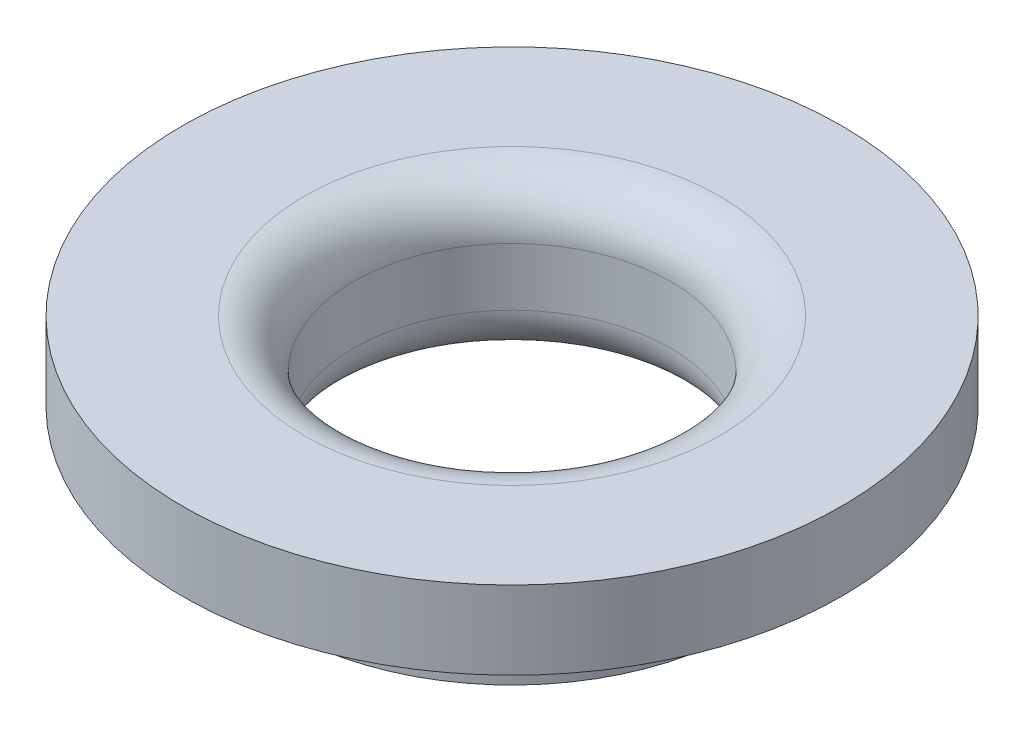
ISO-10303-21;
HEADER;
FILE_DESCRIPTION(('STEP AP214'),'2;1');
FILE_NAME('part.step','',(''),(''),'','','');
FILE_SCHEMA(('AUTOMOTIVE_DESIGN { 1 0 10303 214 1 1 1 1 }'));
ENDSEC;
DATA;
#1=APPLICATION_CONTEXT('core data for automotive mechanical design processes');
#2=APPLICATION_PROTOCOL_DEFINITION('international standard','automotive_design',2000,#1);
#3=PRODUCT_CONTEXT('',#1,'mechanical');
#4=PRODUCT('Part','Part','',(#3));
#5=PRODUCT_RELATED_PRODUCT_CATEGORY('part','',(#4));
#6=PRODUCT_DEFINITION_FORMATION('','',#4);
#7=PRODUCT_DEFINITION_CONTEXT('part definition',#1,'design');
#8=PRODUCT_DEFINITION('design','',#6,#7);
#9=PRODUCT_DEFINITION_SHAPE('','',#8);
#10=(LENGTH_UNIT() NAMED_UNIT(*) SI_UNIT(.MILLI.,.METRE.));
#11=(NAMED_UNIT(*) PLANE_ANGLE_UNIT() SI_UNIT($,.RADIAN.));
#12=(NAMED_UNIT(*) SI_UNIT($,.STERADIAN.) SOLID_ANGLE_UNIT());
#13=UNCERTAINTY_MEASURE_WITH_UNIT(LENGTH_MEASURE(1.E-05),#10,'distance_accuracy_value','');
#14=(GEOMETRIC_REPRESENTATION_CONTEXT(3) GLOBAL_UNCERTAINTY_ASSIGNED_CONTEXT((#13)) GLOBAL_UNIT_ASSIGNED_CONTEXT((#10,
#11,#12)) REPRESENTATION_CONTEXT('',''));
#15=CARTESIAN_POINT('',(0.,0.,0.));
#16=DIRECTION('',(0.,0.,1.));
#17=DIRECTION('',(1.,0.,0.));
#18=AXIS2_PLACEMENT_3D('',#15,#16,#17);
#19=CARTESIAN_POINT('',(0.,0.,0.));
#20=DIRECTION('',(0.,-1.,0.));
#21=DIRECTION('',(0.,0.,-1.));
#22=AXIS2_PLACEMENT_3D('',#19,#20,#21);
#23=CYLINDRICAL_SURFACE('',#22,6.699);
#24=CARTESIAN_POINT('',(0.,1.5875,0.));
#25=DIRECTION('',(0.,-1.,0.));
#26=DIRECTION('',(0.,0.,-1.));
#27=AXIS2_PLACEMENT_3D('',#24,#25,#26);
#28=CIRCLE('',#27,6.699);
#29=CARTESIAN_POINT('',(0.,1.5875,-6.699));
#30=VERTEX_POINT('',#29);
#31=EDGE_CURVE('E57',#30,#30,#28,.T.);
#32=ORIENTED_EDGE('',*,*,#31,.F.);
#33=EDGE_LOOP('',(#32));
#34=FACE_BOUND('',#33,.T.);
#35=CARTESIAN_POINT('',(0.,3.175,0.));
#36=DIRECTION('',(0.,-1.,0.));
#37=DIRECTION('',(0.,0.,-1.));
#38=AXIS2_PLACEMENT_3D('',#35,#36,#37);
#39=CIRCLE('',#38,6.699);
#40=CARTESIAN_POINT('',(0.,3.175,-6.699));
#41=VERTEX_POINT('',#40);
#42=EDGE_CURVE('E66',#41,#41,#39,.T.);
#43=ORIENTED_EDGE('',*,*,#42,.T.);
#44=EDGE_LOOP('',(#43));
#45=FACE_BOUND('',#44,.T.);
#46=ADVANCED_FACE('F37',(#34,#45),#23,.T.);
#47=CARTESIAN_POINT('',(0.,1.5875,0.));
#48=DIRECTION('',(0.,1.,0.));
#49=DIRECTION('',(0.,0.,1.));
#50=AXIS2_PLACEMENT_3D('',#47,#48,#49);
#51=PLANE('',#50);
#52=CARTESIAN_POINT('',(0.,1.5875,0.));
#53=DIRECTION('',(0.,-1.,0.));
#54=DIRECTION('',(0.,0.,-1.));
#55=AXIS2_PLACEMENT_3D('',#52,#53,#54);
#56=CIRCLE('',#55,4.699);
#57=CARTESIAN_POINT('',(0.,1.5875,-4.699));
#58=VERTEX_POINT('',#57);
#59=EDGE_CURVE('E60',#58,#58,#56,.T.);
#60=ORIENTED_EDGE('',*,*,#59,.F.);
#61=EDGE_LOOP('',(#60));
#62=FACE_BOUND('',#61,.T.);
#63=ORIENTED_EDGE('',*,*,#31,.T.);
#64=EDGE_LOOP('',(#63));
#65=FACE_BOUND('',#64,.T.);
#66=ADVANCED_FACE('F85',(#62,#65),#51,.F.);
#67=CARTESIAN_POINT('',(0.,0.,0.));
#68=DIRECTION('',(0.,-1.,0.));
#69=DIRECTION('',(0.,0.,-1.));
#70=AXIS2_PLACEMENT_3D('',#67,#68,#69);
#71=CYLINDRICAL_SURFACE('',#70,4.699);
#72=ORIENTED_EDGE('',*,*,#59,.T.);
#73=EDGE_LOOP('',(#72));
#74=FACE_BOUND('',#73,.T.);
#75=CARTESIAN_POINT('',(0.,0.,0.));
#76=DIRECTION('',(0.,-1.,0.));
#77=DIRECTION('',(0.,0.,-1.));
#78=AXIS2_PLACEMENT_3D('',#75,#76,#77);
#79=CIRCLE('',#78,4.699);
#80=CARTESIAN_POINT('',(0.,0.,-4.699));
#81=VERTEX_POINT('',#80);
#82=EDGE_CURVE('E63',#81,#81,#79,.T.);
#83=ORIENTED_EDGE('',*,*,#82,.F.);
#84=EDGE_LOOP('',(#83));
#85=FACE_BOUND('',#84,.T.);
#86=ADVANCED_FACE('F91',(#74,#85),#71,.T.);
#87=CARTESIAN_POINT('',(0.,0.,0.));
#88=DIRECTION('',(0.,-1.,0.));
#89=DIRECTION('',(0.,0.,-1.));
#90=AXIS2_PLACEMENT_3D('',#87,#88,#89);
#91=PLANE('',#90);
#92=CARTESIAN_POINT('',(0.,0.,0.));
#93=DIRECTION('',(0.,-1.,0.));
#94=DIRECTION('',(0.,0.,-1.));
#95=AXIS2_PLACEMENT_3D('',#92,#93,#94);
#96=CIRCLE('',#95,4.22);
#97=CARTESIAN_POINT('',(0.,0.,-4.22));
#98=VERTEX_POINT('',#97);
#99=EDGE_CURVE('E44',#98,#98,#96,.F.);
#100=ORIENTED_EDGE('',*,*,#99,.T.);
#101=EDGE_LOOP('',(#100));
#102=FACE_BOUND('',#101,.T.);
#103=ORIENTED_EDGE('',*,*,#82,.T.);
#104=EDGE_LOOP('',(#103));
#105=FACE_BOUND('',#104,.T.);
#106=ADVANCED_FACE('F81',(#102,#105),#91,.T.);
#107=CARTESIAN_POINT('',(0.,0.,0.));
#108=DIRECTION('',(0.,-1.,0.));
#109=DIRECTION('',(0.,0.,-1.));
#110=AXIS2_PLACEMENT_3D('',#107,#108,#109);
#111=CYLINDRICAL_SURFACE('',#110,3.22);
#112=CARTESIAN_POINT('',(0.,1.,0.));
#113=DIRECTION('',(0.,-1.,0.));
#114=DIRECTION('',(0.,0.,-1.));
#115=AXIS2_PLACEMENT_3D('',#112,#113,#114);
#116=CIRCLE('',#115,3.22);
#117=CARTESIAN_POINT('',(0.,1.,-3.22));
#118=VERTEX_POINT('',#117);
#119=EDGE_CURVE('E48',#118,#118,#116,.T.);
#120=ORIENTED_EDGE('',*,*,#119,.T.);
#121=EDGE_LOOP('',(#120));
#122=FACE_BOUND('',#121,.T.);
#123=CARTESIAN_POINT('',(0.,2.175,0.));
#124=DIRECTION('',(0.,1.,0.));
#125=DIRECTION('',(0.,0.,1.));
#126=AXIS2_PLACEMENT_3D('',#123,#124,#125);
#127=CIRCLE('',#126,3.22);
#128=CARTESIAN_POINT('',(0.,2.175,3.22));
#129=VERTEX_POINT('',#128);
#130=EDGE_CURVE('E52',#129,#129,#127,.T.);
#131=ORIENTED_EDGE('',*,*,#130,.T.);
#132=EDGE_LOOP('',(#131));
#133=FACE_BOUND('',#132,.T.);
#134=ADVANCED_FACE('F74',(#122,#133),#111,.F.);
#135=CARTESIAN_POINT('',(0.,3.175,0.));
#136=DIRECTION('',(0.,1.,0.));
#137=DIRECTION('',(0.,0.,1.));
#138=AXIS2_PLACEMENT_3D('',#135,#136,#137);
#139=PLANE('',#138);
#140=CARTESIAN_POINT('',(0.,3.175,0.));
#141=DIRECTION('',(0.,1.,0.));
#142=DIRECTION('',(0.,0.,1.));
#143=AXIS2_PLACEMENT_3D('',#140,#141,#142);
#144=CIRCLE('',#143,4.22);
#145=CARTESIAN_POINT('',(0.,3.175,4.22));
#146=VERTEX_POINT('',#145);
#147=EDGE_CURVE('E10',#146,#146,#144,.F.);
#148=ORIENTED_EDGE('',*,*,#147,.T.);
#149=EDGE_LOOP('',(#148));
#150=FACE_BOUND('',#149,.T.);
#151=ORIENTED_EDGE('',*,*,#42,.F.);
#152=EDGE_LOOP('',(#151));
#153=FACE_BOUND('',#152,.T.);
#154=ADVANCED_FACE('F71',(#150,#153),#139,.T.);
#155=CARTESIAN_POINT('',(0.,1.,0.));
#156=DIRECTION('',(0.,-1.,0.));
#157=DIRECTION('',(0.,0.,-1.));
#158=AXIS2_PLACEMENT_3D('',#155,#156,#157);
#159=TOROIDAL_SURFACE('',#158,4.22,1.);
#160=ORIENTED_EDGE('',*,*,#99,.F.);
#161=EDGE_LOOP('',(#160));
#162=FACE_BOUND('',#161,.T.);
#163=ORIENTED_EDGE('',*,*,#119,.F.);
#164=EDGE_LOOP('',(#163));
#165=FACE_BOUND('',#164,.T.);
#166=ADVANCED_FACE('F73',(#162,#165),#159,.T.);
#167=CARTESIAN_POINT('',(0.,2.175,0.));
#168=DIRECTION('',(0.,1.,0.));
#169=DIRECTION('',(0.,0.,1.));
#170=AXIS2_PLACEMENT_3D('',#167,#168,#169);
#171=TOROIDAL_SURFACE('',#170,4.22,1.);
#172=ORIENTED_EDGE('',*,*,#130,.F.);
#173=EDGE_LOOP('',(#172));
#174=FACE_BOUND('',#173,.T.);
#175=ORIENTED_EDGE('',*,*,#147,.F.);
#176=EDGE_LOOP('',(#175));
#177=FACE_BOUND('',#176,.T.);
#178=ADVANCED_FACE('F39',(#174,#177),#171,.T.);
#179=CLOSED_SHELL('',(#46,#66,#86,#106,#134,#154,#166,#178));
#180=MANIFOLD_SOLID_BREP('B2',#179);
#181=ADVANCED_BREP_SHAPE_REPRESENTATION('',(#18,#180),#14);
#182=SHAPE_DEFINITION_REPRESENTATION(#9,#181);
ENDSEC;
END-ISO-10303-21;
